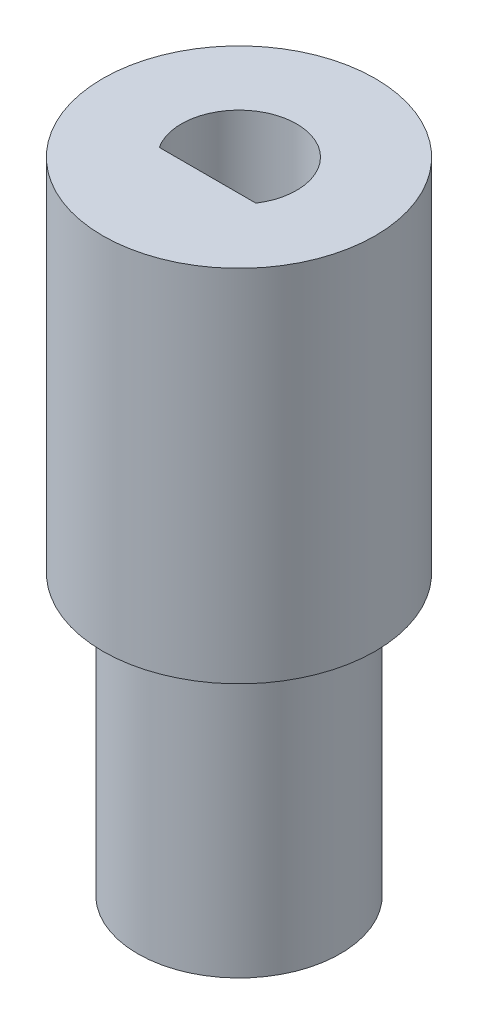
ISO-10303-21;
HEADER;
FILE_DESCRIPTION(('STEP AP214'),'2;1');
FILE_NAME('part.step','',(''),(''),'','','');
FILE_SCHEMA(('AUTOMOTIVE_DESIGN { 1 0 10303 214 1 1 1 1 }'));
ENDSEC;
DATA;
#1=APPLICATION_CONTEXT('core data for automotive mechanical design processes');
#2=APPLICATION_PROTOCOL_DEFINITION('international standard','automotive_design',2000,#1);
#3=PRODUCT_CONTEXT('',#1,'mechanical');
#4=PRODUCT('Part','Part','',(#3));
#5=PRODUCT_RELATED_PRODUCT_CATEGORY('part','',(#4));
#6=PRODUCT_DEFINITION_FORMATION('','',#4);
#7=PRODUCT_DEFINITION_CONTEXT('part definition',#1,'design');
#8=PRODUCT_DEFINITION('design','',#6,#7);
#9=PRODUCT_DEFINITION_SHAPE('','',#8);
#10=(LENGTH_UNIT() NAMED_UNIT(*) SI_UNIT(.MILLI.,.METRE.));
#11=(NAMED_UNIT(*) PLANE_ANGLE_UNIT() SI_UNIT($,.RADIAN.));
#12=(NAMED_UNIT(*) SI_UNIT($,.STERADIAN.) SOLID_ANGLE_UNIT());
#13=UNCERTAINTY_MEASURE_WITH_UNIT(LENGTH_MEASURE(1.E-05),#10,'distance_accuracy_value','');
#14=(GEOMETRIC_REPRESENTATION_CONTEXT(3) GLOBAL_UNCERTAINTY_ASSIGNED_CONTEXT((#13)) GLOBAL_UNIT_ASSIGNED_CONTEXT((#10,
#11,#12)) REPRESENTATION_CONTEXT('',''));
#15=CARTESIAN_POINT('',(0.,0.,0.));
#16=DIRECTION('',(0.,0.,1.));
#17=DIRECTION('',(1.,0.,0.));
#18=AXIS2_PLACEMENT_3D('',#15,#16,#17);
#19=CARTESIAN_POINT('',(0.,0.,0.));
#20=DIRECTION('',(0.,1.,0.));
#21=DIRECTION('',(0.,0.,1.));
#22=AXIS2_PLACEMENT_3D('',#19,#20,#21);
#23=PLANE('',#22);
#24=DIRECTION('',(0.,0.,-1.));
#25=VECTOR('',#24,1.);
#26=CARTESIAN_POINT('',(-0.849999999999987,0.,1.25000000000001));
#27=LINE('',#26,#25);
#28=CARTESIAN_POINT('',(-0.849999999999977,0.,2.24443756874635));
#29=VERTEX_POINT('',#28);
#30=CARTESIAN_POINT('',(-0.849999999999987,0.,1.25000000000001));
#31=VERTEX_POINT('',#30);
#32=EDGE_CURVE('E181',#29,#31,#27,.T.);
#33=ORIENTED_EDGE('',*,*,#32,.F.);
#34=CARTESIAN_POINT('',(0.,0.,0.));
#35=DIRECTION('',(0.,-1.,0.));
#36=DIRECTION('',(0.,0.,-1.));
#37=AXIS2_PLACEMENT_3D('',#34,#35,#36);
#38=CIRCLE('',#37,2.4);
#39=CARTESIAN_POINT('',(0.85,0.,2.24443756874634));
#40=VERTEX_POINT('',#39);
#41=EDGE_CURVE('E187',#40,#29,#38,.T.);
#42=ORIENTED_EDGE('',*,*,#41,.F.);
#43=DIRECTION('',(0.,0.,1.));
#44=VECTOR('',#43,1.);
#45=CARTESIAN_POINT('',(0.85,0.,2.24443756874634));
#46=LINE('',#45,#44);
#47=CARTESIAN_POINT('',(0.85,0.,1.25));
#48=VERTEX_POINT('',#47);
#49=EDGE_CURVE('E269',#48,#40,#46,.T.);
#50=ORIENTED_EDGE('',*,*,#49,.F.);
#51=CARTESIAN_POINT('',(1.25,0.,1.25));
#52=DIRECTION('',(0.,1.,0.));
#53=DIRECTION('',(0.,0.,-1.));
#54=AXIS2_PLACEMENT_3D('',#51,#52,#53);
#55=CIRCLE('',#54,0.4);
#56=CARTESIAN_POINT('',(1.25,0.,0.85));
#57=VERTEX_POINT('',#56);
#58=EDGE_CURVE('E266',#57,#48,#55,.T.);
#59=ORIENTED_EDGE('',*,*,#58,.F.);
#60=DIRECTION('',(-1.,0.,0.));
#61=VECTOR('',#60,1.);
#62=CARTESIAN_POINT('',(1.25,0.,0.85));
#63=LINE('',#62,#61);
#64=CARTESIAN_POINT('',(2.24443756874634,0.,0.85));
#65=VERTEX_POINT('',#64);
#66=EDGE_CURVE('E263',#65,#57,#63,.T.);
#67=ORIENTED_EDGE('',*,*,#66,.F.);
#68=CARTESIAN_POINT('',(0.,0.,0.));
#69=DIRECTION('',(0.,-1.,0.));
#70=DIRECTION('',(0.,0.,-1.));
#71=AXIS2_PLACEMENT_3D('',#68,#69,#70);
#72=CIRCLE('',#71,2.4);
#73=CARTESIAN_POINT('',(2.24443756874634,0.,-0.850000000000008));
#74=VERTEX_POINT('',#73);
#75=EDGE_CURVE('E260',#74,#65,#72,.T.);
#76=ORIENTED_EDGE('',*,*,#75,.F.);
#77=DIRECTION('',(1.,0.,0.));
#78=VECTOR('',#77,1.);
#79=CARTESIAN_POINT('',(2.24443756874634,0.,-0.850000000000008));
#80=LINE('',#79,#78);
#81=CARTESIAN_POINT('',(1.25,0.,-0.850000000000005));
#82=VERTEX_POINT('',#81);
#83=EDGE_CURVE('E257',#82,#74,#80,.T.);
#84=ORIENTED_EDGE('',*,*,#83,.F.);
#85=CARTESIAN_POINT('',(1.25,0.,-1.25));
#86=DIRECTION('',(0.,1.,0.));
#87=DIRECTION('',(0.,0.,-1.));
#88=AXIS2_PLACEMENT_3D('',#85,#86,#87);
#89=CIRCLE('',#88,0.4);
#90=CARTESIAN_POINT('',(0.849999999999996,0.,-1.25000000000001));
#91=VERTEX_POINT('',#90);
#92=EDGE_CURVE('E254',#91,#82,#89,.T.);
#93=ORIENTED_EDGE('',*,*,#92,.F.);
#94=DIRECTION('',(0.,0.,1.));
#95=VECTOR('',#94,1.);
#96=CARTESIAN_POINT('',(0.849999999999996,0.,-1.25000000000001));
#97=LINE('',#96,#95);
#98=CARTESIAN_POINT('',(0.849999999999992,0.,-2.24443756874635));
#99=VERTEX_POINT('',#98);
#100=EDGE_CURVE('E251',#99,#91,#97,.T.);
#101=ORIENTED_EDGE('',*,*,#100,.F.);
#102=CARTESIAN_POINT('',(0.,0.,0.));
#103=DIRECTION('',(0.,-1.,0.));
#104=DIRECTION('',(0.,0.,-1.));
#105=AXIS2_PLACEMENT_3D('',#102,#103,#104);
#106=CIRCLE('',#105,2.4);
#107=CARTESIAN_POINT('',(-0.850000000000017,0.,-2.24443756874634));
#108=VERTEX_POINT('',#107);
#109=EDGE_CURVE('E248',#108,#99,#106,.T.);
#110=ORIENTED_EDGE('',*,*,#109,.F.);
#111=DIRECTION('',(0.,0.,-1.));
#112=VECTOR('',#111,1.);
#113=CARTESIAN_POINT('',(-0.850000000000016,0.,-2.24443756874634));
#114=LINE('',#113,#112);
#115=CARTESIAN_POINT('',(-0.850000000000009,0.,-1.25));
#116=VERTEX_POINT('',#115);
#117=EDGE_CURVE('E245',#116,#108,#114,.T.);
#118=ORIENTED_EDGE('',*,*,#117,.F.);
#119=CARTESIAN_POINT('',(-1.25000000000001,0.,-1.24999999999999));
#120=DIRECTION('',(0.,1.,0.));
#121=DIRECTION('',(0.,0.,-1.));
#122=AXIS2_PLACEMENT_3D('',#119,#120,#121);
#123=CIRCLE('',#122,0.4);
#124=CARTESIAN_POINT('',(-1.25000000000001,0.,-0.849999999999992));
#125=VERTEX_POINT('',#124);
#126=EDGE_CURVE('E242',#125,#116,#123,.T.);
#127=ORIENTED_EDGE('',*,*,#126,.F.);
#128=DIRECTION('',(1.,0.,0.));
#129=VECTOR('',#128,1.);
#130=CARTESIAN_POINT('',(-1.25000000000001,0.,-0.849999999999992));
#131=LINE('',#130,#129);
#132=CARTESIAN_POINT('',(-2.24443756874635,0.,-0.849999999999985));
#133=VERTEX_POINT('',#132);
#134=EDGE_CURVE('E239',#133,#125,#131,.T.);
#135=ORIENTED_EDGE('',*,*,#134,.F.);
#136=CARTESIAN_POINT('',(0.,0.,0.));
#137=DIRECTION('',(0.,-1.,0.));
#138=DIRECTION('',(0.,0.,-1.));
#139=AXIS2_PLACEMENT_3D('',#136,#137,#138);
#140=CIRCLE('',#139,2.4);
#141=CARTESIAN_POINT('',(-2.24443756874633,0.,0.850000000000025));
#142=VERTEX_POINT('',#141);
#143=EDGE_CURVE('E236',#142,#133,#140,.T.);
#144=ORIENTED_EDGE('',*,*,#143,.F.);
#145=DIRECTION('',(-1.,0.,0.));
#146=VECTOR('',#145,1.);
#147=CARTESIAN_POINT('',(-2.24443756874633,0.,0.850000000000024));
#148=LINE('',#147,#146);
#149=CARTESIAN_POINT('',(-1.24999999999999,0.,0.850000000000013));
#150=VERTEX_POINT('',#149);
#151=EDGE_CURVE('E233',#150,#142,#148,.T.);
#152=ORIENTED_EDGE('',*,*,#151,.F.);
#153=CARTESIAN_POINT('',(-1.24999999999999,0.,1.25000000000001));
#154=DIRECTION('',(0.,1.,0.));
#155=DIRECTION('',(0.,0.,-1.));
#156=AXIS2_PLACEMENT_3D('',#153,#154,#155);
#157=CIRCLE('',#156,0.4);
#158=EDGE_CURVE('E230',#31,#150,#157,.T.);
#159=ORIENTED_EDGE('',*,*,#158,.F.);
#160=EDGE_LOOP('',(#33,#42,#50,#59,#67,#76,#84,#93,#101,#110,#118,#127,#135,#144,#152,#159));
#161=FACE_BOUND('',#160,.T.);
#162=CARTESIAN_POINT('',(0.,0.,0.));
#163=DIRECTION('',(0.,-1.,0.));
#164=DIRECTION('',(0.,0.,-1.));
#165=AXIS2_PLACEMENT_3D('',#162,#163,#164);
#166=CIRCLE('',#165,2.9);
#167=CARTESIAN_POINT('',(0.,0.,-2.9));
#168=VERTEX_POINT('',#167);
#169=EDGE_CURVE('E11',#168,#168,#166,.T.);
#170=ORIENTED_EDGE('',*,*,#169,.T.);
#171=EDGE_LOOP('',(#170));
#172=FACE_BOUND('',#171,.T.);
#173=ADVANCED_FACE('F37',(#161,#172),#23,.F.);
#174=CARTESIAN_POINT('',(0.,0.,0.));
#175=DIRECTION('',(0.,-1.,0.));
#176=DIRECTION('',(0.,0.,-1.));
#177=AXIS2_PLACEMENT_3D('',#174,#175,#176);
#178=CYLINDRICAL_SURFACE('',#177,2.9);
#179=ORIENTED_EDGE('',*,*,#169,.F.);
#180=EDGE_LOOP('',(#179));
#181=FACE_BOUND('',#180,.T.);
#182=CARTESIAN_POINT('',(0.,8.,0.));
#183=DIRECTION('',(0.,-1.,0.));
#184=DIRECTION('',(0.,0.,-1.));
#185=AXIS2_PLACEMENT_3D('',#182,#183,#184);
#186=CIRCLE('',#185,2.9);
#187=CARTESIAN_POINT('',(0.,8.,-2.9));
#188=VERTEX_POINT('',#187);
#189=EDGE_CURVE('E44',#188,#188,#186,.T.);
#190=ORIENTED_EDGE('',*,*,#189,.T.);
#191=EDGE_LOOP('',(#190));
#192=FACE_BOUND('',#191,.T.);
#193=ADVANCED_FACE('F312',(#181,#192),#178,.T.);
#194=CARTESIAN_POINT('',(-2.9,8.,0.));
#195=DIRECTION('',(0.,1.,0.));
#196=DIRECTION('',(0.,0.,1.));
#197=AXIS2_PLACEMENT_3D('',#194,#195,#196);
#198=PLANE('',#197);
#199=ORIENTED_EDGE('',*,*,#189,.F.);
#200=EDGE_LOOP('',(#199));
#201=FACE_BOUND('',#200,.T.);
#202=CARTESIAN_POINT('',(0.,8.,0.));
#203=DIRECTION('',(0.,-1.,0.));
#204=DIRECTION('',(0.,0.,-1.));
#205=AXIS2_PLACEMENT_3D('',#202,#203,#204);
#206=CIRCLE('',#205,3.9);
#207=CARTESIAN_POINT('',(0.,8.,-3.9));
#208=VERTEX_POINT('',#207);
#209=EDGE_CURVE('E307',#208,#208,#206,.T.);
#210=ORIENTED_EDGE('',*,*,#209,.T.);
#211=EDGE_LOOP('',(#210));
#212=FACE_BOUND('',#211,.T.);
#213=ADVANCED_FACE('F314',(#201,#212),#198,.F.);
#214=CARTESIAN_POINT('',(0.,0.,0.));
#215=DIRECTION('',(0.,-1.,0.));
#216=DIRECTION('',(0.,0.,-1.));
#217=AXIS2_PLACEMENT_3D('',#214,#215,#216);
#218=CYLINDRICAL_SURFACE('',#217,3.9);
#219=ORIENTED_EDGE('',*,*,#209,.F.);
#220=EDGE_LOOP('',(#219));
#221=FACE_BOUND('',#220,.T.);
#222=CARTESIAN_POINT('',(0.,18.3,0.));
#223=DIRECTION('',(0.,-1.,0.));
#224=DIRECTION('',(0.,0.,-1.));
#225=AXIS2_PLACEMENT_3D('',#222,#223,#224);
#226=CIRCLE('',#225,3.9);
#227=CARTESIAN_POINT('',(0.,18.3,-3.9));
#228=VERTEX_POINT('',#227);
#229=EDGE_CURVE('E275',#228,#228,#226,.T.);
#230=ORIENTED_EDGE('',*,*,#229,.T.);
#231=EDGE_LOOP('',(#230));
#232=FACE_BOUND('',#231,.T.);
#233=ADVANCED_FACE('F317',(#221,#232),#218,.T.);
#234=CARTESIAN_POINT('',(-3.9,18.3,0.));
#235=DIRECTION('',(0.,-1.,0.));
#236=DIRECTION('',(0.,0.,-1.));
#237=AXIS2_PLACEMENT_3D('',#234,#235,#236);
#238=PLANE('',#237);
#239=DIRECTION('',(1.,0.,0.));
#240=VECTOR('',#239,1.);
#241=CARTESIAN_POINT('',(-1.38293166859393,18.3,0.9));
#242=LINE('',#241,#240);
#243=CARTESIAN_POINT('',(-1.38293166859393,18.3,0.9));
#244=VERTEX_POINT('',#243);
#245=CARTESIAN_POINT('',(1.38293166859393,18.3,0.9));
#246=VERTEX_POINT('',#245);
#247=EDGE_CURVE('E174',#244,#246,#242,.T.);
#248=ORIENTED_EDGE('',*,*,#247,.F.);
#249=CARTESIAN_POINT('',(0.,18.3,0.));
#250=DIRECTION('',(0.,1.,0.));
#251=DIRECTION('',(0.,0.,1.));
#252=AXIS2_PLACEMENT_3D('',#249,#250,#251);
#253=CIRCLE('',#252,1.65);
#254=EDGE_CURVE('E51',#246,#244,#253,.T.);
#255=ORIENTED_EDGE('',*,*,#254,.F.);
#256=EDGE_LOOP('',(#248,#255));
#257=FACE_BOUND('',#256,.T.);
#258=ORIENTED_EDGE('',*,*,#229,.F.);
#259=EDGE_LOOP('',(#258));
#260=FACE_BOUND('',#259,.T.);
#261=ADVANCED_FACE('F323',(#257,#260),#238,.F.);
#262=CARTESIAN_POINT('',(0.,8.,0.));
#263=DIRECTION('',(0.,-1.,0.));
#264=DIRECTION('',(0.,0.,-1.));
#265=AXIS2_PLACEMENT_3D('',#262,#263,#264);
#266=CYLINDRICAL_SURFACE('',#265,2.4);
#267=ORIENTED_EDGE('',*,*,#41,.T.);
#268=DIRECTION('',(0.,-1.,0.));
#269=VECTOR('',#268,1.);
#270=CARTESIAN_POINT('',(-0.849999999999977,8.,2.24443756874635));
#271=LINE('',#270,#269);
#272=CARTESIAN_POINT('',(-0.849999999999977,8.,2.24443756874635));
#273=VERTEX_POINT('',#272);
#274=EDGE_CURVE('E59',#273,#29,#271,.T.);
#275=ORIENTED_EDGE('',*,*,#274,.F.);
#276=CARTESIAN_POINT('',(0.,8.,0.));
#277=DIRECTION('',(0.,-1.,0.));
#278=DIRECTION('',(0.,0.,-1.));
#279=AXIS2_PLACEMENT_3D('',#276,#277,#278);
#280=CIRCLE('',#279,2.4);
#281=CARTESIAN_POINT('',(0.85,8.,2.24443756874634));
#282=VERTEX_POINT('',#281);
#283=EDGE_CURVE('E183',#282,#273,#280,.T.);
#284=ORIENTED_EDGE('',*,*,#283,.F.);
#285=DIRECTION('',(0.,-1.,0.));
#286=VECTOR('',#285,1.);
#287=CARTESIAN_POINT('',(0.85,8.,2.24443756874634));
#288=LINE('',#287,#286);
#289=EDGE_CURVE('E273',#282,#40,#288,.T.);
#290=ORIENTED_EDGE('',*,*,#289,.T.);
#291=EDGE_LOOP('',(#267,#275,#284,#290));
#292=FACE_BOUND('',#291,.T.);
#293=ADVANCED_FACE('F328',(#292),#266,.F.);
#294=CARTESIAN_POINT('',(0.85,8.,2.24443756874634));
#295=DIRECTION('',(1.,0.,0.));
#296=DIRECTION('',(0.,0.,-1.));
#297=AXIS2_PLACEMENT_3D('',#294,#295,#296);
#298=PLANE('',#297);
#299=ORIENTED_EDGE('',*,*,#49,.T.);
#300=ORIENTED_EDGE('',*,*,#289,.F.);
#301=DIRECTION('',(0.,0.,1.));
#302=VECTOR('',#301,1.);
#303=CARTESIAN_POINT('',(0.85,8.,2.24443756874634));
#304=LINE('',#303,#302);
#305=CARTESIAN_POINT('',(0.85,8.,1.25));
#306=VERTEX_POINT('',#305);
#307=EDGE_CURVE('E226',#306,#282,#304,.T.);
#308=ORIENTED_EDGE('',*,*,#307,.F.);
#309=DIRECTION('',(0.,-1.,0.));
#310=VECTOR('',#309,1.);
#311=CARTESIAN_POINT('',(0.85,8.,1.25));
#312=LINE('',#311,#310);
#313=EDGE_CURVE('E276',#306,#48,#312,.T.);
#314=ORIENTED_EDGE('',*,*,#313,.T.);
#315=EDGE_LOOP('',(#299,#300,#308,#314));
#316=FACE_BOUND('',#315,.T.);
#317=ADVANCED_FACE('F334',(#316),#298,.F.);
#318=CARTESIAN_POINT('',(1.25,8.,1.25));
#319=DIRECTION('',(0.,-1.,0.));
#320=DIRECTION('',(0.,0.,-1.));
#321=AXIS2_PLACEMENT_3D('',#318,#319,#320);
#322=CYLINDRICAL_SURFACE('',#321,0.4);
#323=ORIENTED_EDGE('',*,*,#58,.T.);
#324=ORIENTED_EDGE('',*,*,#313,.F.);
#325=CARTESIAN_POINT('',(1.25,8.,1.25));
#326=DIRECTION('',(0.,1.,0.));
#327=DIRECTION('',(0.,0.,-1.));
#328=AXIS2_PLACEMENT_3D('',#325,#326,#327);
#329=CIRCLE('',#328,0.4);
#330=CARTESIAN_POINT('',(1.25,8.,0.85));
#331=VERTEX_POINT('',#330);
#332=EDGE_CURVE('E223',#331,#306,#329,.T.);
#333=ORIENTED_EDGE('',*,*,#332,.F.);
#334=DIRECTION('',(0.,-1.,0.));
#335=VECTOR('',#334,1.);
#336=CARTESIAN_POINT('',(1.25,8.,0.85));
#337=LINE('',#336,#335);
#338=EDGE_CURVE('E278',#331,#57,#337,.T.);
#339=ORIENTED_EDGE('',*,*,#338,.T.);
#340=EDGE_LOOP('',(#323,#324,#333,#339));
#341=FACE_BOUND('',#340,.T.);
#342=ADVANCED_FACE('F365',(#341),#322,.T.);
#343=CARTESIAN_POINT('',(1.25,8.,0.85));
#344=DIRECTION('',(0.,0.,1.));
#345=DIRECTION('',(1.,0.,0.));
#346=AXIS2_PLACEMENT_3D('',#343,#344,#345);
#347=PLANE('',#346);
#348=ORIENTED_EDGE('',*,*,#66,.T.);
#349=ORIENTED_EDGE('',*,*,#338,.F.);
#350=DIRECTION('',(-1.,0.,0.));
#351=VECTOR('',#350,1.);
#352=CARTESIAN_POINT('',(1.25,8.,0.85));
#353=LINE('',#352,#351);
#354=CARTESIAN_POINT('',(2.24443756874634,8.,0.85));
#355=VERTEX_POINT('',#354);
#356=EDGE_CURVE('E220',#355,#331,#353,.T.);
#357=ORIENTED_EDGE('',*,*,#356,.F.);
#358=DIRECTION('',(0.,-1.,0.));
#359=VECTOR('',#358,1.);
#360=CARTESIAN_POINT('',(2.24443756874634,8.,0.85));
#361=LINE('',#360,#359);
#362=EDGE_CURVE('E280',#355,#65,#361,.T.);
#363=ORIENTED_EDGE('',*,*,#362,.T.);
#364=EDGE_LOOP('',(#348,#349,#357,#363));
#365=FACE_BOUND('',#364,.T.);
#366=ADVANCED_FACE('F369',(#365),#347,.F.);
#367=CARTESIAN_POINT('',(0.,8.,0.));
#368=DIRECTION('',(0.,-1.,0.));
#369=DIRECTION('',(0.,0.,-1.));
#370=AXIS2_PLACEMENT_3D('',#367,#368,#369);
#371=CYLINDRICAL_SURFACE('',#370,2.4);
#372=ORIENTED_EDGE('',*,*,#75,.T.);
#373=ORIENTED_EDGE('',*,*,#362,.F.);
#374=CARTESIAN_POINT('',(0.,8.,0.));
#375=DIRECTION('',(0.,-1.,0.));
#376=DIRECTION('',(0.,0.,-1.));
#377=AXIS2_PLACEMENT_3D('',#374,#375,#376);
#378=CIRCLE('',#377,2.4);
#379=CARTESIAN_POINT('',(2.24443756874634,8.,-0.850000000000008));
#380=VERTEX_POINT('',#379);
#381=EDGE_CURVE('E218',#380,#355,#378,.T.);
#382=ORIENTED_EDGE('',*,*,#381,.F.);
#383=DIRECTION('',(0.,-1.,0.));
#384=VECTOR('',#383,1.);
#385=CARTESIAN_POINT('',(2.24443756874634,8.,-0.850000000000008));
#386=LINE('',#385,#384);
#387=EDGE_CURVE('E282',#380,#74,#386,.T.);
#388=ORIENTED_EDGE('',*,*,#387,.T.);
#389=EDGE_LOOP('',(#372,#373,#382,#388));
#390=FACE_BOUND('',#389,.T.);
#391=ADVANCED_FACE('F373',(#390),#371,.F.);
#392=CARTESIAN_POINT('',(2.24443756874634,8.,-0.850000000000008));
#393=DIRECTION('',(0.,0.,-1.));
#394=DIRECTION('',(-1.,0.,0.));
#395=AXIS2_PLACEMENT_3D('',#392,#393,#394);
#396=PLANE('',#395);
#397=ORIENTED_EDGE('',*,*,#83,.T.);
#398=ORIENTED_EDGE('',*,*,#387,.F.);
#399=DIRECTION('',(1.,0.,0.));
#400=VECTOR('',#399,1.);
#401=CARTESIAN_POINT('',(2.24443756874634,8.,-0.850000000000008));
#402=LINE('',#401,#400);
#403=CARTESIAN_POINT('',(1.25,8.,-0.850000000000005));
#404=VERTEX_POINT('',#403);
#405=EDGE_CURVE('E215',#404,#380,#402,.T.);
#406=ORIENTED_EDGE('',*,*,#405,.F.);
#407=DIRECTION('',(0.,-1.,0.));
#408=VECTOR('',#407,1.);
#409=CARTESIAN_POINT('',(1.25,8.,-0.850000000000005));
#410=LINE('',#409,#408);
#411=EDGE_CURVE('E284',#404,#82,#410,.T.);
#412=ORIENTED_EDGE('',*,*,#411,.T.);
#413=EDGE_LOOP('',(#397,#398,#406,#412));
#414=FACE_BOUND('',#413,.T.);
#415=ADVANCED_FACE('F378',(#414),#396,.F.);
#416=CARTESIAN_POINT('',(1.25,8.,-1.25));
#417=DIRECTION('',(0.,-1.,0.));
#418=DIRECTION('',(0.,0.,-1.));
#419=AXIS2_PLACEMENT_3D('',#416,#417,#418);
#420=CYLINDRICAL_SURFACE('',#419,0.4);
#421=ORIENTED_EDGE('',*,*,#92,.T.);
#422=ORIENTED_EDGE('',*,*,#411,.F.);
#423=CARTESIAN_POINT('',(1.25,8.,-1.25));
#424=DIRECTION('',(0.,1.,0.));
#425=DIRECTION('',(0.,0.,-1.));
#426=AXIS2_PLACEMENT_3D('',#423,#424,#425);
#427=CIRCLE('',#426,0.4);
#428=CARTESIAN_POINT('',(0.849999999999996,8.,-1.25000000000001));
#429=VERTEX_POINT('',#428);
#430=EDGE_CURVE('E212',#429,#404,#427,.T.);
#431=ORIENTED_EDGE('',*,*,#430,.F.);
#432=DIRECTION('',(0.,-1.,0.));
#433=VECTOR('',#432,1.);
#434=CARTESIAN_POINT('',(0.849999999999996,8.,-1.25000000000001));
#435=LINE('',#434,#433);
#436=EDGE_CURVE('E286',#429,#91,#435,.T.);
#437=ORIENTED_EDGE('',*,*,#436,.T.);
#438=EDGE_LOOP('',(#421,#422,#431,#437));
#439=FACE_BOUND('',#438,.T.);
#440=ADVANCED_FACE('F382',(#439),#420,.T.);
#441=CARTESIAN_POINT('',(0.849999999999996,8.,-1.25000000000001));
#442=DIRECTION('',(1.,0.,0.));
#443=DIRECTION('',(0.,0.,-1.));
#444=AXIS2_PLACEMENT_3D('',#441,#442,#443);
#445=PLANE('',#444);
#446=ORIENTED_EDGE('',*,*,#100,.T.);
#447=ORIENTED_EDGE('',*,*,#436,.F.);
#448=DIRECTION('',(0.,0.,1.));
#449=VECTOR('',#448,1.);
#450=CARTESIAN_POINT('',(0.849999999999996,8.,-1.25000000000001));
#451=LINE('',#450,#449);
#452=CARTESIAN_POINT('',(0.849999999999992,8.,-2.24443756874635));
#453=VERTEX_POINT('',#452);
#454=EDGE_CURVE('E209',#453,#429,#451,.T.);
#455=ORIENTED_EDGE('',*,*,#454,.F.);
#456=DIRECTION('',(0.,-1.,0.));
#457=VECTOR('',#456,1.);
#458=CARTESIAN_POINT('',(0.849999999999992,8.,-2.24443756874635));
#459=LINE('',#458,#457);
#460=EDGE_CURVE('E288',#453,#99,#459,.T.);
#461=ORIENTED_EDGE('',*,*,#460,.T.);
#462=EDGE_LOOP('',(#446,#447,#455,#461));
#463=FACE_BOUND('',#462,.T.);
#464=ADVANCED_FACE('F385',(#463),#445,.F.);
#465=CARTESIAN_POINT('',(0.,8.,0.));
#466=DIRECTION('',(0.,-1.,0.));
#467=DIRECTION('',(0.,0.,-1.));
#468=AXIS2_PLACEMENT_3D('',#465,#466,#467);
#469=CYLINDRICAL_SURFACE('',#468,2.4);
#470=ORIENTED_EDGE('',*,*,#109,.T.);
#471=ORIENTED_EDGE('',*,*,#460,.F.);
#472=CARTESIAN_POINT('',(0.,8.,0.));
#473=DIRECTION('',(0.,-1.,0.));
#474=DIRECTION('',(0.,0.,-1.));
#475=AXIS2_PLACEMENT_3D('',#472,#473,#474);
#476=CIRCLE('',#475,2.4);
#477=CARTESIAN_POINT('',(-0.850000000000017,8.,-2.24443756874634));
#478=VERTEX_POINT('',#477);
#479=EDGE_CURVE('E207',#478,#453,#476,.T.);
#480=ORIENTED_EDGE('',*,*,#479,.F.);
#481=DIRECTION('',(0.,-1.,0.));
#482=VECTOR('',#481,1.);
#483=CARTESIAN_POINT('',(-0.850000000000017,8.,-2.24443756874634));
#484=LINE('',#483,#482);
#485=EDGE_CURVE('E290',#478,#108,#484,.T.);
#486=ORIENTED_EDGE('',*,*,#485,.T.);
#487=EDGE_LOOP('',(#470,#471,#480,#486));
#488=FACE_BOUND('',#487,.T.);
#489=ADVANCED_FACE('F391',(#488),#469,.F.);
#490=CARTESIAN_POINT('',(-0.850000000000016,8.,-2.24443756874634));
#491=DIRECTION('',(-1.,0.,0.));
#492=DIRECTION('',(0.,0.,1.));
#493=AXIS2_PLACEMENT_3D('',#490,#491,#492);
#494=PLANE('',#493);
#495=ORIENTED_EDGE('',*,*,#117,.T.);
#496=ORIENTED_EDGE('',*,*,#485,.F.);
#497=DIRECTION('',(0.,0.,-1.));
#498=VECTOR('',#497,1.);
#499=CARTESIAN_POINT('',(-0.850000000000016,8.,-2.24443756874634));
#500=LINE('',#499,#498);
#501=CARTESIAN_POINT('',(-0.850000000000009,8.,-1.25));
#502=VERTEX_POINT('',#501);
#503=EDGE_CURVE('E204',#502,#478,#500,.T.);
#504=ORIENTED_EDGE('',*,*,#503,.F.);
#505=DIRECTION('',(0.,-1.,0.));
#506=VECTOR('',#505,1.);
#507=CARTESIAN_POINT('',(-0.850000000000009,8.,-1.25));
#508=LINE('',#507,#506);
#509=EDGE_CURVE('E292',#502,#116,#508,.T.);
#510=ORIENTED_EDGE('',*,*,#509,.T.);
#511=EDGE_LOOP('',(#495,#496,#504,#510));
#512=FACE_BOUND('',#511,.T.);
#513=ADVANCED_FACE('F395',(#512),#494,.F.);
#514=CARTESIAN_POINT('',(-1.25000000000001,8.,-1.24999999999999));
#515=DIRECTION('',(0.,-1.,0.));
#516=DIRECTION('',(0.,0.,-1.));
#517=AXIS2_PLACEMENT_3D('',#514,#515,#516);
#518=CYLINDRICAL_SURFACE('',#517,0.4);
#519=ORIENTED_EDGE('',*,*,#126,.T.);
#520=ORIENTED_EDGE('',*,*,#509,.F.);
#521=CARTESIAN_POINT('',(-1.25000000000001,8.,-1.24999999999999));
#522=DIRECTION('',(0.,1.,0.));
#523=DIRECTION('',(0.,0.,-1.));
#524=AXIS2_PLACEMENT_3D('',#521,#522,#523);
#525=CIRCLE('',#524,0.4);
#526=CARTESIAN_POINT('',(-1.25000000000001,8.,-0.849999999999992));
#527=VERTEX_POINT('',#526);
#528=EDGE_CURVE('E201',#527,#502,#525,.T.);
#529=ORIENTED_EDGE('',*,*,#528,.F.);
#530=DIRECTION('',(0.,-1.,0.));
#531=VECTOR('',#530,1.);
#532=CARTESIAN_POINT('',(-1.25000000000001,8.,-0.849999999999992));
#533=LINE('',#532,#531);
#534=EDGE_CURVE('E294',#527,#125,#533,.T.);
#535=ORIENTED_EDGE('',*,*,#534,.T.);
#536=EDGE_LOOP('',(#519,#520,#529,#535));
#537=FACE_BOUND('',#536,.T.);
#538=ADVANCED_FACE('F398',(#537),#518,.T.);
#539=CARTESIAN_POINT('',(-1.25000000000001,8.,-0.849999999999992));
#540=DIRECTION('',(0.,0.,-1.));
#541=DIRECTION('',(-1.,0.,0.));
#542=AXIS2_PLACEMENT_3D('',#539,#540,#541);
#543=PLANE('',#542);
#544=ORIENTED_EDGE('',*,*,#134,.T.);
#545=ORIENTED_EDGE('',*,*,#534,.F.);
#546=DIRECTION('',(1.,0.,0.));
#547=VECTOR('',#546,1.);
#548=CARTESIAN_POINT('',(-1.25000000000001,8.,-0.849999999999992));
#549=LINE('',#548,#547);
#550=CARTESIAN_POINT('',(-2.24443756874635,8.,-0.849999999999985));
#551=VERTEX_POINT('',#550);
#552=EDGE_CURVE('E198',#551,#527,#549,.T.);
#553=ORIENTED_EDGE('',*,*,#552,.F.);
#554=DIRECTION('',(0.,-1.,0.));
#555=VECTOR('',#554,1.);
#556=CARTESIAN_POINT('',(-2.24443756874635,8.,-0.849999999999985));
#557=LINE('',#556,#555);
#558=EDGE_CURVE('E296',#551,#133,#557,.T.);
#559=ORIENTED_EDGE('',*,*,#558,.T.);
#560=EDGE_LOOP('',(#544,#545,#553,#559));
#561=FACE_BOUND('',#560,.T.);
#562=ADVANCED_FACE('F402',(#561),#543,.F.);
#563=CARTESIAN_POINT('',(0.,8.,0.));
#564=DIRECTION('',(0.,-1.,0.));
#565=DIRECTION('',(0.,0.,-1.));
#566=AXIS2_PLACEMENT_3D('',#563,#564,#565);
#567=CYLINDRICAL_SURFACE('',#566,2.4);
#568=ORIENTED_EDGE('',*,*,#143,.T.);
#569=ORIENTED_EDGE('',*,*,#558,.F.);
#570=CARTESIAN_POINT('',(0.,8.,0.));
#571=DIRECTION('',(0.,-1.,0.));
#572=DIRECTION('',(0.,0.,-1.));
#573=AXIS2_PLACEMENT_3D('',#570,#571,#572);
#574=CIRCLE('',#573,2.4);
#575=CARTESIAN_POINT('',(-2.24443756874633,8.,0.850000000000025));
#576=VERTEX_POINT('',#575);
#577=EDGE_CURVE('E196',#576,#551,#574,.T.);
#578=ORIENTED_EDGE('',*,*,#577,.F.);
#579=DIRECTION('',(0.,-1.,0.));
#580=VECTOR('',#579,1.);
#581=CARTESIAN_POINT('',(-2.24443756874633,8.,0.850000000000025));
#582=LINE('',#581,#580);
#583=EDGE_CURVE('E298',#576,#142,#582,.T.);
#584=ORIENTED_EDGE('',*,*,#583,.T.);
#585=EDGE_LOOP('',(#568,#569,#578,#584));
#586=FACE_BOUND('',#585,.T.);
#587=ADVANCED_FACE('F407',(#586),#567,.F.);
#588=CARTESIAN_POINT('',(-2.24443756874633,8.,0.850000000000024));
#589=DIRECTION('',(0.,0.,1.));
#590=DIRECTION('',(1.,0.,0.));
#591=AXIS2_PLACEMENT_3D('',#588,#589,#590);
#592=PLANE('',#591);
#593=ORIENTED_EDGE('',*,*,#151,.T.);
#594=ORIENTED_EDGE('',*,*,#583,.F.);
#595=DIRECTION('',(-1.,0.,0.));
#596=VECTOR('',#595,1.);
#597=CARTESIAN_POINT('',(-2.24443756874633,8.,0.850000000000024));
#598=LINE('',#597,#596);
#599=CARTESIAN_POINT('',(-1.24999999999999,8.,0.850000000000013));
#600=VERTEX_POINT('',#599);
#601=EDGE_CURVE('E193',#600,#576,#598,.T.);
#602=ORIENTED_EDGE('',*,*,#601,.F.);
#603=DIRECTION('',(0.,-1.,0.));
#604=VECTOR('',#603,1.);
#605=CARTESIAN_POINT('',(-1.24999999999999,8.,0.850000000000013));
#606=LINE('',#605,#604);
#607=EDGE_CURVE('E300',#600,#150,#606,.T.);
#608=ORIENTED_EDGE('',*,*,#607,.T.);
#609=EDGE_LOOP('',(#593,#594,#602,#608));
#610=FACE_BOUND('',#609,.T.);
#611=ADVANCED_FACE('F409',(#610),#592,.F.);
#612=CARTESIAN_POINT('',(-1.24999999999999,8.,1.25000000000001));
#613=DIRECTION('',(0.,-1.,0.));
#614=DIRECTION('',(0.,0.,-1.));
#615=AXIS2_PLACEMENT_3D('',#612,#613,#614);
#616=CYLINDRICAL_SURFACE('',#615,0.4);
#617=ORIENTED_EDGE('',*,*,#158,.T.);
#618=ORIENTED_EDGE('',*,*,#607,.F.);
#619=CARTESIAN_POINT('',(-1.24999999999999,8.,1.25000000000001));
#620=DIRECTION('',(0.,1.,0.));
#621=DIRECTION('',(0.,0.,-1.));
#622=AXIS2_PLACEMENT_3D('',#619,#620,#621);
#623=CIRCLE('',#622,0.4);
#624=CARTESIAN_POINT('',(-0.849999999999987,8.,1.25000000000001));
#625=VERTEX_POINT('',#624);
#626=EDGE_CURVE('E190',#625,#600,#623,.T.);
#627=ORIENTED_EDGE('',*,*,#626,.F.);
#628=DIRECTION('',(0.,-1.,0.));
#629=VECTOR('',#628,1.);
#630=CARTESIAN_POINT('',(-0.849999999999987,8.,1.25000000000001));
#631=LINE('',#630,#629);
#632=EDGE_CURVE('E302',#625,#31,#631,.T.);
#633=ORIENTED_EDGE('',*,*,#632,.T.);
#634=EDGE_LOOP('',(#617,#618,#627,#633));
#635=FACE_BOUND('',#634,.T.);
#636=ADVANCED_FACE('F354',(#635),#616,.T.);
#637=CARTESIAN_POINT('',(-0.849999999999987,8.,1.25000000000001));
#638=DIRECTION('',(-1.,0.,0.));
#639=DIRECTION('',(0.,0.,1.));
#640=AXIS2_PLACEMENT_3D('',#637,#638,#639);
#641=PLANE('',#640);
#642=ORIENTED_EDGE('',*,*,#32,.T.);
#643=ORIENTED_EDGE('',*,*,#632,.F.);
#644=DIRECTION('',(0.,0.,-1.));
#645=VECTOR('',#644,1.);
#646=CARTESIAN_POINT('',(-0.849999999999987,8.,1.25000000000001));
#647=LINE('',#646,#645);
#648=EDGE_CURVE('E186',#273,#625,#647,.T.);
#649=ORIENTED_EDGE('',*,*,#648,.F.);
#650=ORIENTED_EDGE('',*,*,#274,.T.);
#651=EDGE_LOOP('',(#642,#643,#649,#650));
#652=FACE_BOUND('',#651,.T.);
#653=ADVANCED_FACE('F351',(#652),#641,.F.);
#654=CARTESIAN_POINT('',(0.,8.,0.));
#655=DIRECTION('',(0.,-1.,0.));
#656=DIRECTION('',(0.,0.,-1.));
#657=AXIS2_PLACEMENT_3D('',#654,#655,#656);
#658=PLANE('',#657);
#659=ORIENTED_EDGE('',*,*,#283,.T.);
#660=ORIENTED_EDGE('',*,*,#648,.T.);
#661=ORIENTED_EDGE('',*,*,#626,.T.);
#662=ORIENTED_EDGE('',*,*,#601,.T.);
#663=ORIENTED_EDGE('',*,*,#577,.T.);
#664=ORIENTED_EDGE('',*,*,#552,.T.);
#665=ORIENTED_EDGE('',*,*,#528,.T.);
#666=ORIENTED_EDGE('',*,*,#503,.T.);
#667=ORIENTED_EDGE('',*,*,#479,.T.);
#668=ORIENTED_EDGE('',*,*,#454,.T.);
#669=ORIENTED_EDGE('',*,*,#430,.T.);
#670=ORIENTED_EDGE('',*,*,#405,.T.);
#671=ORIENTED_EDGE('',*,*,#381,.T.);
#672=ORIENTED_EDGE('',*,*,#356,.T.);
#673=ORIENTED_EDGE('',*,*,#332,.T.);
#674=ORIENTED_EDGE('',*,*,#307,.T.);
#675=EDGE_LOOP('',(#659,#660,#661,#662,#663,#664,#665,#666,#667,#668,#669,#670,#671,#672,#673,#674));
#676=FACE_BOUND('',#675,.T.);
#677=ADVANCED_FACE('F357',(#676),#658,.T.);
#678=CARTESIAN_POINT('',(0.,8.3,0.));
#679=DIRECTION('',(0.,1.,0.));
#680=DIRECTION('',(0.,0.,1.));
#681=AXIS2_PLACEMENT_3D('',#678,#679,#680);
#682=CYLINDRICAL_SURFACE('',#681,1.65);
#683=ORIENTED_EDGE('',*,*,#254,.T.);
#684=DIRECTION('',(0.,1.,0.));
#685=VECTOR('',#684,1.);
#686=CARTESIAN_POINT('',(-1.38293166859393,8.3,0.9));
#687=LINE('',#686,#685);
#688=CARTESIAN_POINT('',(-1.38293166859393,8.3,0.9));
#689=VERTEX_POINT('',#688);
#690=EDGE_CURVE('E160',#689,#244,#687,.T.);
#691=ORIENTED_EDGE('',*,*,#690,.F.);
#692=CARTESIAN_POINT('',(0.,8.3,0.));
#693=DIRECTION('',(0.,1.,0.));
#694=DIRECTION('',(0.,0.,1.));
#695=AXIS2_PLACEMENT_3D('',#692,#693,#694);
#696=CIRCLE('',#695,1.65);
#697=CARTESIAN_POINT('',(1.38293166859393,8.3,0.9));
#698=VERTEX_POINT('',#697);
#699=EDGE_CURVE('E163',#698,#689,#696,.T.);
#700=ORIENTED_EDGE('',*,*,#699,.F.);
#701=DIRECTION('',(0.,1.,0.));
#702=VECTOR('',#701,1.);
#703=CARTESIAN_POINT('',(1.38293166859393,8.3,0.9));
#704=LINE('',#703,#702);
#705=EDGE_CURVE('E169',#698,#246,#704,.T.);
#706=ORIENTED_EDGE('',*,*,#705,.T.);
#707=EDGE_LOOP('',(#683,#691,#700,#706));
#708=FACE_BOUND('',#707,.T.);
#709=ADVANCED_FACE('F162',(#708),#682,.F.);
#710=CARTESIAN_POINT('',(-1.38293166859393,8.3,0.9));
#711=DIRECTION('',(0.,0.,1.));
#712=DIRECTION('',(1.,0.,0.));
#713=AXIS2_PLACEMENT_3D('',#710,#711,#712);
#714=PLANE('',#713);
#715=ORIENTED_EDGE('',*,*,#247,.T.);
#716=ORIENTED_EDGE('',*,*,#705,.F.);
#717=DIRECTION('',(1.,0.,0.));
#718=VECTOR('',#717,1.);
#719=CARTESIAN_POINT('',(-1.38293166859393,8.3,0.9));
#720=LINE('',#719,#718);
#721=EDGE_CURVE('E170',#689,#698,#720,.T.);
#722=ORIENTED_EDGE('',*,*,#721,.F.);
#723=ORIENTED_EDGE('',*,*,#690,.T.);
#724=EDGE_LOOP('',(#715,#716,#722,#723));
#725=FACE_BOUND('',#724,.T.);
#726=ADVANCED_FACE('F176',(#725),#714,.F.);
#727=CARTESIAN_POINT('',(0.,8.3,0.));
#728=DIRECTION('',(0.,1.,0.));
#729=DIRECTION('',(0.,0.,1.));
#730=AXIS2_PLACEMENT_3D('',#727,#728,#729);
#731=PLANE('',#730);
#732=ORIENTED_EDGE('',*,*,#699,.T.);
#733=ORIENTED_EDGE('',*,*,#721,.T.);
#734=EDGE_LOOP('',(#732,#733));
#735=FACE_BOUND('',#734,.T.);
#736=ADVANCED_FACE('F173',(#735),#731,.T.);
#737=CLOSED_SHELL('',(#173,#193,#213,#233,#261,#293,#317,#342,#366,#391,#415,#440,#464,#489,
#513,#538,#562,#587,#611,#636,#653,#677,#709,#726,#736));
#738=MANIFOLD_SOLID_BREP('B2',#737);
#739=ADVANCED_BREP_SHAPE_REPRESENTATION('',(#18,#738),#14);
#740=SHAPE_DEFINITION_REPRESENTATION(#9,#739);
ENDSEC;
END-ISO-10303-21;
